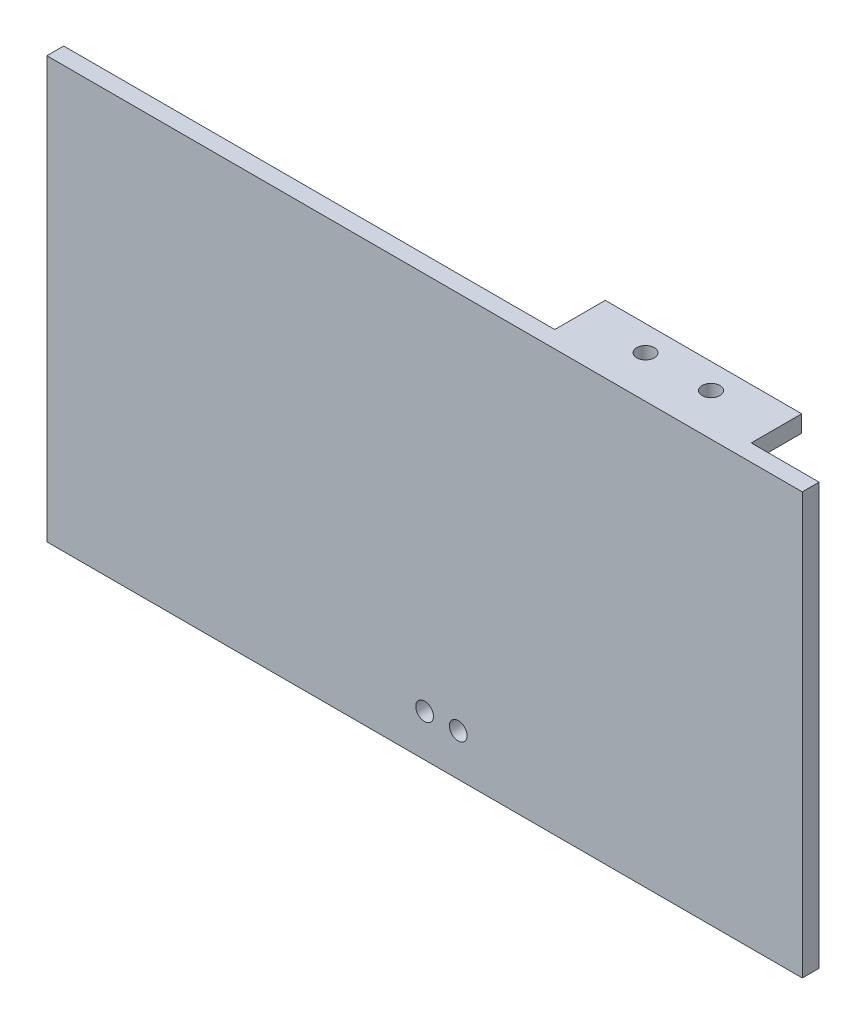
ISO-10303-21;
HEADER;
FILE_DESCRIPTION(('STEP AP214'),'2;1');
FILE_NAME('part.step','',(''),(''),'','','');
FILE_SCHEMA(('AUTOMOTIVE_DESIGN { 1 0 10303 214 1 1 1 1 }'));
ENDSEC;
DATA;
#1=APPLICATION_CONTEXT('core data for automotive mechanical design processes');
#2=APPLICATION_PROTOCOL_DEFINITION('international standard','automotive_design',2000,#1);
#3=PRODUCT_CONTEXT('',#1,'mechanical');
#4=PRODUCT('Part','Part','',(#3));
#5=PRODUCT_RELATED_PRODUCT_CATEGORY('part','',(#4));
#6=PRODUCT_DEFINITION_FORMATION('','',#4);
#7=PRODUCT_DEFINITION_CONTEXT('part definition',#1,'design');
#8=PRODUCT_DEFINITION('design','',#6,#7);
#9=PRODUCT_DEFINITION_SHAPE('','',#8);
#10=(LENGTH_UNIT() NAMED_UNIT(*) SI_UNIT(.MILLI.,.METRE.));
#11=(NAMED_UNIT(*) PLANE_ANGLE_UNIT() SI_UNIT($,.RADIAN.));
#12=(NAMED_UNIT(*) SI_UNIT($,.STERADIAN.) SOLID_ANGLE_UNIT());
#13=UNCERTAINTY_MEASURE_WITH_UNIT(LENGTH_MEASURE(1.E-05),#10,'distance_accuracy_value','');
#14=(GEOMETRIC_REPRESENTATION_CONTEXT(3) GLOBAL_UNCERTAINTY_ASSIGNED_CONTEXT((#13)) GLOBAL_UNIT_ASSIGNED_CONTEXT((#10,
#11,#12)) REPRESENTATION_CONTEXT('',''));
#15=CARTESIAN_POINT('',(0.,0.,0.));
#16=DIRECTION('',(0.,0.,1.));
#17=DIRECTION('',(1.,0.,0.));
#18=AXIS2_PLACEMENT_3D('',#15,#16,#17);
#19=CARTESIAN_POINT('',(0.,75.,-3.));
#20=DIRECTION('',(0.,0.,1.));
#21=DIRECTION('',(1.,0.,0.));
#22=AXIS2_PLACEMENT_3D('',#19,#20,#21);
#23=PLANE('',#22);
#24=CARTESIAN_POINT('',(73.29,7.49999999999999,-3.));
#25=DIRECTION('',(0.,0.,1.));
#26=DIRECTION('',(1.,0.,0.));
#27=AXIS2_PLACEMENT_3D('',#24,#25,#26);
#28=CIRCLE('',#27,1.57500000000001);
#29=CARTESIAN_POINT('',(74.865,7.49999999999999,-3.));
#30=VERTEX_POINT('',#29);
#31=EDGE_CURVE('E190',#30,#30,#28,.T.);
#32=ORIENTED_EDGE('',*,*,#31,.T.);
#33=EDGE_LOOP('',(#32));
#34=FACE_BOUND('',#33,.T.);
#35=CARTESIAN_POINT('',(67.29,7.5,-3.));
#36=DIRECTION('',(0.,0.,1.));
#37=DIRECTION('',(1.,0.,0.));
#38=AXIS2_PLACEMENT_3D('',#35,#36,#37);
#39=CIRCLE('',#38,1.57499999999999);
#40=CARTESIAN_POINT('',(68.865,7.5,-3.));
#41=VERTEX_POINT('',#40);
#42=EDGE_CURVE('E292',#41,#41,#39,.T.);
#43=ORIENTED_EDGE('',*,*,#42,.T.);
#44=EDGE_LOOP('',(#43));
#45=FACE_BOUND('',#44,.T.);
#46=DIRECTION('',(0.,-1.,0.));
#47=VECTOR('',#46,1.);
#48=CARTESIAN_POINT('',(122.48,75.,-3.));
#49=LINE('',#48,#47);
#50=CARTESIAN_POINT('',(122.48,75.,-3.));
#51=VERTEX_POINT('',#50);
#52=CARTESIAN_POINT('',(122.48,72.,-3.));
#53=VERTEX_POINT('',#52);
#54=EDGE_CURVE('E129',#51,#53,#49,.T.);
#55=ORIENTED_EDGE('',*,*,#54,.F.);
#56=DIRECTION('',(-1.,0.,0.));
#57=VECTOR('',#56,1.);
#58=CARTESIAN_POINT('',(0.,75.,-3.));
#59=LINE('',#58,#57);
#60=CARTESIAN_POINT('',(134.58,75.,-3.));
#61=VERTEX_POINT('',#60);
#62=EDGE_CURVE('E153',#61,#51,#59,.T.);
#63=ORIENTED_EDGE('',*,*,#62,.F.);
#64=DIRECTION('',(0.,-1.,0.));
#65=VECTOR('',#64,1.);
#66=CARTESIAN_POINT('',(134.58,75.,-3.));
#67=LINE('',#66,#65);
#68=CARTESIAN_POINT('',(134.58,0.,-3.));
#69=VERTEX_POINT('',#68);
#70=EDGE_CURVE('E168',#61,#69,#67,.T.);
#71=ORIENTED_EDGE('',*,*,#70,.T.);
#72=DIRECTION('',(-1.,0.,0.));
#73=VECTOR('',#72,1.);
#74=CARTESIAN_POINT('',(0.,0.,-3.));
#75=LINE('',#74,#73);
#76=CARTESIAN_POINT('',(0.,0.,-3.));
#77=VERTEX_POINT('',#76);
#78=EDGE_CURVE('E147',#69,#77,#75,.T.);
#79=ORIENTED_EDGE('',*,*,#78,.T.);
#80=DIRECTION('',(0.,-1.,0.));
#81=VECTOR('',#80,1.);
#82=CARTESIAN_POINT('',(0.,75.,-3.));
#83=LINE('',#82,#81);
#84=CARTESIAN_POINT('',(0.,75.,-3.));
#85=VERTEX_POINT('',#84);
#86=EDGE_CURVE('E156',#85,#77,#83,.T.);
#87=ORIENTED_EDGE('',*,*,#86,.F.);
#88=CARTESIAN_POINT('',(87.48,75.,-3.));
#89=VERTEX_POINT('',#88);
#90=EDGE_CURVE('E62',#89,#85,#59,.T.);
#91=ORIENTED_EDGE('',*,*,#90,.F.);
#92=DIRECTION('',(0.,1.,0.));
#93=VECTOR('',#92,1.);
#94=CARTESIAN_POINT('',(87.48,75.,-3.));
#95=LINE('',#94,#93);
#96=CARTESIAN_POINT('',(87.48,72.,-3.));
#97=VERTEX_POINT('',#96);
#98=EDGE_CURVE('E126',#97,#89,#95,.T.);
#99=ORIENTED_EDGE('',*,*,#98,.F.);
#100=DIRECTION('',(-1.,0.,0.));
#101=VECTOR('',#100,1.);
#102=CARTESIAN_POINT('',(122.48,72.,-3.));
#103=LINE('',#102,#101);
#104=EDGE_CURVE('E56',#53,#97,#103,.T.);
#105=ORIENTED_EDGE('',*,*,#104,.F.);
#106=EDGE_LOOP('',(#55,#63,#71,#79,#87,#91,#99,#105));
#107=FACE_BOUND('',#106,.T.);
#108=ADVANCED_FACE('F38',(#34,#45,#107),#23,.F.);
#109=CARTESIAN_POINT('',(0.,75.,0.));
#110=DIRECTION('',(1.,0.,0.));
#111=DIRECTION('',(0.,0.,-1.));
#112=AXIS2_PLACEMENT_3D('',#109,#110,#111);
#113=PLANE('',#112);
#114=DIRECTION('',(0.,0.,1.));
#115=VECTOR('',#114,1.);
#116=CARTESIAN_POINT('',(0.,0.,0.));
#117=LINE('',#116,#115);
#118=CARTESIAN_POINT('',(0.,0.,0.));
#119=VERTEX_POINT('',#118);
#120=EDGE_CURVE('E131',#77,#119,#117,.T.);
#121=ORIENTED_EDGE('',*,*,#120,.T.);
#122=DIRECTION('',(0.,-1.,0.));
#123=VECTOR('',#122,1.);
#124=CARTESIAN_POINT('',(0.,75.,0.));
#125=LINE('',#124,#123);
#126=CARTESIAN_POINT('',(0.,75.,0.));
#127=VERTEX_POINT('',#126);
#128=EDGE_CURVE('E11',#127,#119,#125,.T.);
#129=ORIENTED_EDGE('',*,*,#128,.F.);
#130=DIRECTION('',(0.,0.,1.));
#131=VECTOR('',#130,1.);
#132=CARTESIAN_POINT('',(0.,75.,0.));
#133=LINE('',#132,#131);
#134=EDGE_CURVE('E142',#85,#127,#133,.T.);
#135=ORIENTED_EDGE('',*,*,#134,.F.);
#136=ORIENTED_EDGE('',*,*,#86,.T.);
#137=EDGE_LOOP('',(#121,#129,#135,#136));
#138=FACE_BOUND('',#137,.T.);
#139=ADVANCED_FACE('F40',(#138),#113,.F.);
#140=CARTESIAN_POINT('',(0.,75.,0.));
#141=DIRECTION('',(0.,0.,-1.));
#142=DIRECTION('',(-1.,0.,0.));
#143=AXIS2_PLACEMENT_3D('',#140,#141,#142);
#144=PLANE('',#143);
#145=CARTESIAN_POINT('',(73.29,7.49999999999999,0.));
#146=DIRECTION('',(0.,0.,1.));
#147=DIRECTION('',(1.,0.,0.));
#148=AXIS2_PLACEMENT_3D('',#145,#146,#147);
#149=CIRCLE('',#148,1.57500000000001);
#150=CARTESIAN_POINT('',(74.865,7.49999999999999,0.));
#151=VERTEX_POINT('',#150);
#152=EDGE_CURVE('E241',#151,#151,#149,.T.);
#153=ORIENTED_EDGE('',*,*,#152,.F.);
#154=EDGE_LOOP('',(#153));
#155=FACE_BOUND('',#154,.T.);
#156=CARTESIAN_POINT('',(67.29,7.5,0.));
#157=DIRECTION('',(0.,0.,1.));
#158=DIRECTION('',(1.,0.,0.));
#159=AXIS2_PLACEMENT_3D('',#156,#157,#158);
#160=CIRCLE('',#159,1.57499999999999);
#161=CARTESIAN_POINT('',(68.865,7.5,0.));
#162=VERTEX_POINT('',#161);
#163=EDGE_CURVE('E245',#162,#162,#160,.T.);
#164=ORIENTED_EDGE('',*,*,#163,.F.);
#165=EDGE_LOOP('',(#164));
#166=FACE_BOUND('',#165,.T.);
#167=DIRECTION('',(1.,0.,0.));
#168=VECTOR('',#167,1.);
#169=CARTESIAN_POINT('',(0.,0.,0.));
#170=LINE('',#169,#168);
#171=CARTESIAN_POINT('',(134.58,0.,0.));
#172=VERTEX_POINT('',#171);
#173=EDGE_CURVE('E136',#119,#172,#170,.T.);
#174=ORIENTED_EDGE('',*,*,#173,.T.);
#175=DIRECTION('',(0.,-1.,0.));
#176=VECTOR('',#175,1.);
#177=CARTESIAN_POINT('',(134.58,75.,0.));
#178=LINE('',#177,#176);
#179=CARTESIAN_POINT('',(134.58,75.,0.));
#180=VERTEX_POINT('',#179);
#181=EDGE_CURVE('E48',#180,#172,#178,.T.);
#182=ORIENTED_EDGE('',*,*,#181,.F.);
#183=DIRECTION('',(1.,0.,0.));
#184=VECTOR('',#183,1.);
#185=CARTESIAN_POINT('',(0.,75.,0.));
#186=LINE('',#185,#184);
#187=EDGE_CURVE('E146',#127,#180,#186,.T.);
#188=ORIENTED_EDGE('',*,*,#187,.F.);
#189=ORIENTED_EDGE('',*,*,#128,.T.);
#190=EDGE_LOOP('',(#174,#182,#188,#189));
#191=FACE_BOUND('',#190,.T.);
#192=ADVANCED_FACE('F223',(#155,#166,#191),#144,.F.);
#193=CARTESIAN_POINT('',(134.58,75.,0.));
#194=DIRECTION('',(-1.,0.,0.));
#195=DIRECTION('',(0.,0.,1.));
#196=AXIS2_PLACEMENT_3D('',#193,#194,#195);
#197=PLANE('',#196);
#198=DIRECTION('',(0.,0.,-1.));
#199=VECTOR('',#198,1.);
#200=CARTESIAN_POINT('',(134.58,0.,0.));
#201=LINE('',#200,#199);
#202=EDGE_CURVE('E160',#172,#69,#201,.T.);
#203=ORIENTED_EDGE('',*,*,#202,.T.);
#204=ORIENTED_EDGE('',*,*,#70,.F.);
#205=DIRECTION('',(0.,0.,-1.));
#206=VECTOR('',#205,1.);
#207=CARTESIAN_POINT('',(134.58,75.,0.));
#208=LINE('',#207,#206);
#209=EDGE_CURVE('E150',#180,#61,#208,.T.);
#210=ORIENTED_EDGE('',*,*,#209,.F.);
#211=ORIENTED_EDGE('',*,*,#181,.T.);
#212=EDGE_LOOP('',(#203,#204,#210,#211));
#213=FACE_BOUND('',#212,.T.);
#214=ADVANCED_FACE('F231',(#213),#197,.F.);
#215=CARTESIAN_POINT('',(0.,75.,0.));
#216=DIRECTION('',(0.,-1.,0.));
#217=DIRECTION('',(0.,0.,-1.));
#218=AXIS2_PLACEMENT_3D('',#215,#216,#217);
#219=PLANE('',#218);
#220=CARTESIAN_POINT('',(110.813333333333,75.,-7.5));
#221=DIRECTION('',(0.,1.,0.));
#222=DIRECTION('',(0.,0.,1.));
#223=AXIS2_PLACEMENT_3D('',#220,#221,#222);
#224=CIRCLE('',#223,1.57499999999999);
#225=CARTESIAN_POINT('',(110.813333333333,75.,-5.92500000000001));
#226=VERTEX_POINT('',#225);
#227=EDGE_CURVE('E177',#226,#226,#224,.T.);
#228=ORIENTED_EDGE('',*,*,#227,.F.);
#229=EDGE_LOOP('',(#228));
#230=FACE_BOUND('',#229,.T.);
#231=CARTESIAN_POINT('',(99.1466666666667,75.,-7.5));
#232=DIRECTION('',(0.,1.,0.));
#233=DIRECTION('',(0.,0.,1.));
#234=AXIS2_PLACEMENT_3D('',#231,#232,#233);
#235=CIRCLE('',#234,1.57499999999999);
#236=CARTESIAN_POINT('',(99.1466666666667,75.,-5.92500000000001));
#237=VERTEX_POINT('',#236);
#238=EDGE_CURVE('E184',#237,#237,#235,.T.);
#239=ORIENTED_EDGE('',*,*,#238,.F.);
#240=EDGE_LOOP('',(#239));
#241=FACE_BOUND('',#240,.T.);
#242=ORIENTED_EDGE('',*,*,#134,.T.);
#243=ORIENTED_EDGE('',*,*,#187,.T.);
#244=ORIENTED_EDGE('',*,*,#209,.T.);
#245=ORIENTED_EDGE('',*,*,#62,.T.);
#246=DIRECTION('',(0.,0.,1.));
#247=VECTOR('',#246,1.);
#248=CARTESIAN_POINT('',(122.48,75.,-12.));
#249=LINE('',#248,#247);
#250=CARTESIAN_POINT('',(122.48,75.,-12.));
#251=VERTEX_POINT('',#250);
#252=EDGE_CURVE('E199',#251,#51,#249,.T.);
#253=ORIENTED_EDGE('',*,*,#252,.F.);
#254=DIRECTION('',(1.,0.,0.));
#255=VECTOR('',#254,1.);
#256=CARTESIAN_POINT('',(122.48,75.,-12.));
#257=LINE('',#256,#255);
#258=CARTESIAN_POINT('',(87.48,75.,-12.));
#259=VERTEX_POINT('',#258);
#260=EDGE_CURVE('E121',#259,#251,#257,.T.);
#261=ORIENTED_EDGE('',*,*,#260,.F.);
#262=DIRECTION('',(0.,0.,1.));
#263=VECTOR('',#262,1.);
#264=CARTESIAN_POINT('',(87.48,75.,-12.));
#265=LINE('',#264,#263);
#266=EDGE_CURVE('E138',#259,#89,#265,.T.);
#267=ORIENTED_EDGE('',*,*,#266,.T.);
#268=ORIENTED_EDGE('',*,*,#90,.T.);
#269=EDGE_LOOP('',(#242,#243,#244,#245,#253,#261,#267,#268));
#270=FACE_BOUND('',#269,.T.);
#271=ADVANCED_FACE('F211',(#230,#241,#270),#219,.F.);
#272=CARTESIAN_POINT('',(0.,0.,0.));
#273=DIRECTION('',(0.,-1.,0.));
#274=DIRECTION('',(0.,0.,-1.));
#275=AXIS2_PLACEMENT_3D('',#272,#273,#274);
#276=PLANE('',#275);
#277=ORIENTED_EDGE('',*,*,#120,.F.);
#278=ORIENTED_EDGE('',*,*,#78,.F.);
#279=ORIENTED_EDGE('',*,*,#202,.F.);
#280=ORIENTED_EDGE('',*,*,#173,.F.);
#281=EDGE_LOOP('',(#277,#278,#279,#280));
#282=FACE_BOUND('',#281,.T.);
#283=ADVANCED_FACE('F229',(#282),#276,.T.);
#284=CARTESIAN_POINT('',(122.48,75.,-12.));
#285=DIRECTION('',(-1.,0.,0.));
#286=DIRECTION('',(0.,0.,1.));
#287=AXIS2_PLACEMENT_3D('',#284,#285,#286);
#288=PLANE('',#287);
#289=ORIENTED_EDGE('',*,*,#54,.T.);
#290=DIRECTION('',(0.,0.,1.));
#291=VECTOR('',#290,1.);
#292=CARTESIAN_POINT('',(122.48,72.,-12.));
#293=LINE('',#292,#291);
#294=CARTESIAN_POINT('',(122.48,72.,-12.));
#295=VERTEX_POINT('',#294);
#296=EDGE_CURVE('E108',#295,#53,#293,.T.);
#297=ORIENTED_EDGE('',*,*,#296,.F.);
#298=DIRECTION('',(0.,-1.,0.));
#299=VECTOR('',#298,1.);
#300=CARTESIAN_POINT('',(122.48,75.,-12.));
#301=LINE('',#300,#299);
#302=EDGE_CURVE('E116',#251,#295,#301,.T.);
#303=ORIENTED_EDGE('',*,*,#302,.F.);
#304=ORIENTED_EDGE('',*,*,#252,.T.);
#305=EDGE_LOOP('',(#289,#297,#303,#304));
#306=FACE_BOUND('',#305,.T.);
#307=ADVANCED_FACE('F128',(#306),#288,.F.);
#308=CARTESIAN_POINT('',(122.48,72.,-12.));
#309=DIRECTION('',(0.,1.,0.));
#310=DIRECTION('',(0.,0.,1.));
#311=AXIS2_PLACEMENT_3D('',#308,#309,#310);
#312=PLANE('',#311);
#313=CARTESIAN_POINT('',(110.813333333333,72.,-7.5));
#314=DIRECTION('',(0.,1.,0.));
#315=DIRECTION('',(0.,0.,1.));
#316=AXIS2_PLACEMENT_3D('',#313,#314,#315);
#317=CIRCLE('',#316,1.57499999999999);
#318=CARTESIAN_POINT('',(110.813333333333,72.,-5.92500000000001));
#319=VERTEX_POINT('',#318);
#320=EDGE_CURVE('E42',#319,#319,#317,.T.);
#321=ORIENTED_EDGE('',*,*,#320,.T.);
#322=EDGE_LOOP('',(#321));
#323=FACE_BOUND('',#322,.T.);
#324=CARTESIAN_POINT('',(99.1466666666667,72.,-7.5));
#325=DIRECTION('',(0.,1.,0.));
#326=DIRECTION('',(0.,0.,1.));
#327=AXIS2_PLACEMENT_3D('',#324,#325,#326);
#328=CIRCLE('',#327,1.57499999999999);
#329=CARTESIAN_POINT('',(99.1466666666667,72.,-5.92500000000001));
#330=VERTEX_POINT('',#329);
#331=EDGE_CURVE('E174',#330,#330,#328,.T.);
#332=ORIENTED_EDGE('',*,*,#331,.T.);
#333=EDGE_LOOP('',(#332));
#334=FACE_BOUND('',#333,.T.);
#335=ORIENTED_EDGE('',*,*,#104,.T.);
#336=DIRECTION('',(0.,0.,1.));
#337=VECTOR('',#336,1.);
#338=CARTESIAN_POINT('',(87.48,72.,-12.));
#339=LINE('',#338,#337);
#340=CARTESIAN_POINT('',(87.48,72.,-12.));
#341=VERTEX_POINT('',#340);
#342=EDGE_CURVE('E111',#341,#97,#339,.T.);
#343=ORIENTED_EDGE('',*,*,#342,.F.);
#344=DIRECTION('',(-1.,0.,0.));
#345=VECTOR('',#344,1.);
#346=CARTESIAN_POINT('',(122.48,72.,-12.));
#347=LINE('',#346,#345);
#348=EDGE_CURVE('E104',#295,#341,#347,.T.);
#349=ORIENTED_EDGE('',*,*,#348,.F.);
#350=ORIENTED_EDGE('',*,*,#296,.T.);
#351=EDGE_LOOP('',(#335,#343,#349,#350));
#352=FACE_BOUND('',#351,.T.);
#353=ADVANCED_FACE('F106',(#323,#334,#352),#312,.F.);
#354=CARTESIAN_POINT('',(87.48,75.,-12.));
#355=DIRECTION('',(1.,0.,0.));
#356=DIRECTION('',(0.,0.,-1.));
#357=AXIS2_PLACEMENT_3D('',#354,#355,#356);
#358=PLANE('',#357);
#359=ORIENTED_EDGE('',*,*,#98,.T.);
#360=ORIENTED_EDGE('',*,*,#266,.F.);
#361=DIRECTION('',(0.,1.,0.));
#362=VECTOR('',#361,1.);
#363=CARTESIAN_POINT('',(87.48,75.,-12.));
#364=LINE('',#363,#362);
#365=EDGE_CURVE('E115',#341,#259,#364,.T.);
#366=ORIENTED_EDGE('',*,*,#365,.F.);
#367=ORIENTED_EDGE('',*,*,#342,.T.);
#368=EDGE_LOOP('',(#359,#360,#366,#367));
#369=FACE_BOUND('',#368,.T.);
#370=ADVANCED_FACE('F213',(#369),#358,.F.);
#371=CARTESIAN_POINT('',(0.,0.,-12.));
#372=DIRECTION('',(0.,0.,-1.));
#373=DIRECTION('',(-1.,0.,0.));
#374=AXIS2_PLACEMENT_3D('',#371,#372,#373);
#375=PLANE('',#374);
#376=ORIENTED_EDGE('',*,*,#302,.T.);
#377=ORIENTED_EDGE('',*,*,#348,.T.);
#378=ORIENTED_EDGE('',*,*,#365,.T.);
#379=ORIENTED_EDGE('',*,*,#260,.T.);
#380=EDGE_LOOP('',(#376,#377,#378,#379));
#381=FACE_BOUND('',#380,.T.);
#382=ADVANCED_FACE('F119',(#381),#375,.T.);
#383=CARTESIAN_POINT('',(99.1466666666667,0.,-7.5));
#384=DIRECTION('',(0.,1.,0.));
#385=DIRECTION('',(0.,0.,1.));
#386=AXIS2_PLACEMENT_3D('',#383,#384,#385);
#387=CYLINDRICAL_SURFACE('',#386,1.57499999999999);
#388=ORIENTED_EDGE('',*,*,#238,.T.);
#389=EDGE_LOOP('',(#388));
#390=FACE_BOUND('',#389,.T.);
#391=ORIENTED_EDGE('',*,*,#331,.F.);
#392=EDGE_LOOP('',(#391));
#393=FACE_BOUND('',#392,.T.);
#394=ADVANCED_FACE('F273',(#390,#393),#387,.F.);
#395=CARTESIAN_POINT('',(110.813333333333,0.,-7.5));
#396=DIRECTION('',(0.,1.,0.));
#397=DIRECTION('',(0.,0.,1.));
#398=AXIS2_PLACEMENT_3D('',#395,#396,#397);
#399=CYLINDRICAL_SURFACE('',#398,1.57499999999999);
#400=ORIENTED_EDGE('',*,*,#227,.T.);
#401=EDGE_LOOP('',(#400));
#402=FACE_BOUND('',#401,.T.);
#403=ORIENTED_EDGE('',*,*,#320,.F.);
#404=EDGE_LOOP('',(#403));
#405=FACE_BOUND('',#404,.T.);
#406=ADVANCED_FACE('F276',(#402,#405),#399,.F.);
#407=CARTESIAN_POINT('',(67.29,7.5,-12.));
#408=DIRECTION('',(0.,0.,1.));
#409=DIRECTION('',(1.,0.,0.));
#410=AXIS2_PLACEMENT_3D('',#407,#408,#409);
#411=CYLINDRICAL_SURFACE('',#410,1.57499999999999);
#412=ORIENTED_EDGE('',*,*,#163,.T.);
#413=EDGE_LOOP('',(#412));
#414=FACE_BOUND('',#413,.T.);
#415=ORIENTED_EDGE('',*,*,#42,.F.);
#416=EDGE_LOOP('',(#415));
#417=FACE_BOUND('',#416,.T.);
#418=ADVANCED_FACE('F280',(#414,#417),#411,.F.);
#419=CARTESIAN_POINT('',(73.29,7.49999999999999,-12.));
#420=DIRECTION('',(0.,0.,1.));
#421=DIRECTION('',(1.,0.,0.));
#422=AXIS2_PLACEMENT_3D('',#419,#420,#421);
#423=CYLINDRICAL_SURFACE('',#422,1.57500000000001);
#424=ORIENTED_EDGE('',*,*,#152,.T.);
#425=EDGE_LOOP('',(#424));
#426=FACE_BOUND('',#425,.T.);
#427=ORIENTED_EDGE('',*,*,#31,.F.);
#428=EDGE_LOOP('',(#427));
#429=FACE_BOUND('',#428,.T.);
#430=ADVANCED_FACE('F283',(#426,#429),#423,.F.);
#431=CLOSED_SHELL('',(#108,#139,#192,#214,#271,#283,#307,#353,#370,#382,#394,#406,#418,#430));
#432=MANIFOLD_SOLID_BREP('B2',#431);
#433=ADVANCED_BREP_SHAPE_REPRESENTATION('',(#18,#432),#14);
#434=SHAPE_DEFINITION_REPRESENTATION(#9,#433);
ENDSEC;
END-ISO-10303-21;
